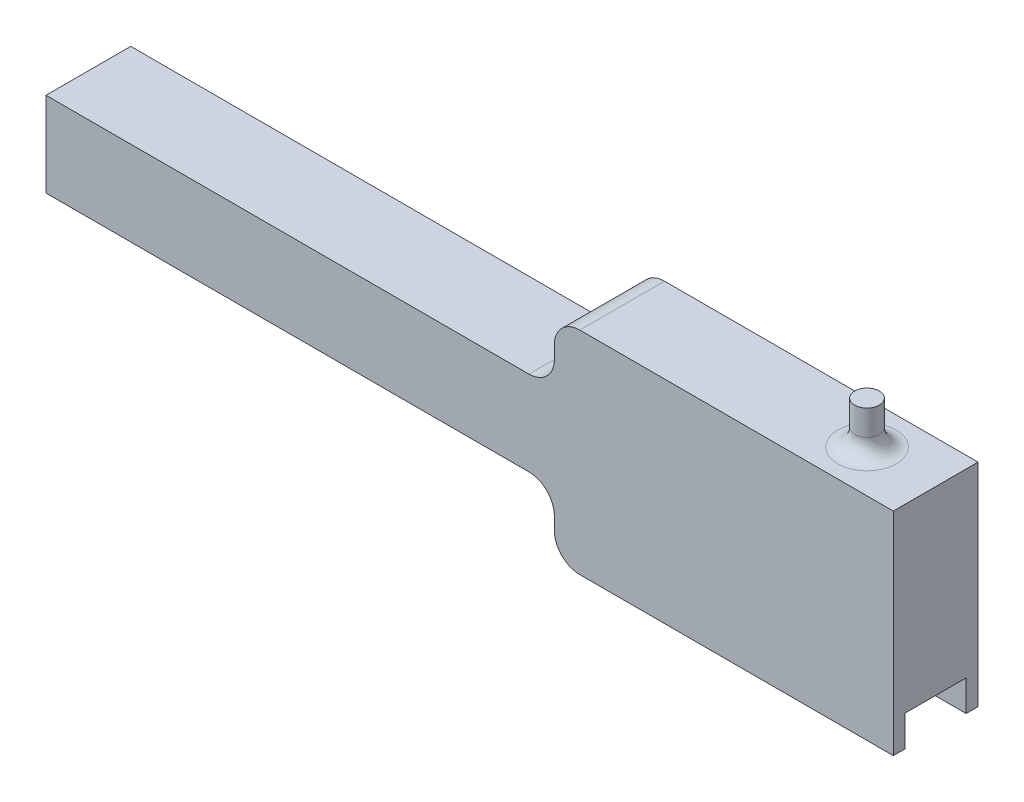
ISO-10303-21;
HEADER;
FILE_DESCRIPTION(('STEP AP214'),'2;1');
FILE_NAME('part.step','',(''),(''),'','','');
FILE_SCHEMA(('AUTOMOTIVE_DESIGN { 1 0 10303 214 1 1 1 1 }'));
ENDSEC;
DATA;
#1=APPLICATION_CONTEXT('core data for automotive mechanical design processes');
#2=APPLICATION_PROTOCOL_DEFINITION('international standard','automotive_design',2000,#1);
#3=PRODUCT_CONTEXT('',#1,'mechanical');
#4=PRODUCT('Part','Part','',(#3));
#5=PRODUCT_RELATED_PRODUCT_CATEGORY('part','',(#4));
#6=PRODUCT_DEFINITION_FORMATION('','',#4);
#7=PRODUCT_DEFINITION_CONTEXT('part definition',#1,'design');
#8=PRODUCT_DEFINITION('design','',#6,#7);
#9=PRODUCT_DEFINITION_SHAPE('','',#8);
#10=(LENGTH_UNIT() NAMED_UNIT(*) SI_UNIT(.MILLI.,.METRE.));
#11=(NAMED_UNIT(*) PLANE_ANGLE_UNIT() SI_UNIT($,.RADIAN.));
#12=(NAMED_UNIT(*) SI_UNIT($,.STERADIAN.) SOLID_ANGLE_UNIT());
#13=UNCERTAINTY_MEASURE_WITH_UNIT(LENGTH_MEASURE(1.E-05),#10,'distance_accuracy_value','');
#14=(GEOMETRIC_REPRESENTATION_CONTEXT(3) GLOBAL_UNCERTAINTY_ASSIGNED_CONTEXT((#13)) GLOBAL_UNIT_ASSIGNED_CONTEXT((#10,
#11,#12)) REPRESENTATION_CONTEXT('',''));
#15=CARTESIAN_POINT('',(0.,0.,0.));
#16=DIRECTION('',(0.,0.,1.));
#17=DIRECTION('',(1.,0.,0.));
#18=AXIS2_PLACEMENT_3D('',#15,#16,#17);
#19=CARTESIAN_POINT('',(50.,12.5,5.));
#20=DIRECTION('',(-1.,0.,0.));
#21=DIRECTION('',(0.,0.,1.));
#22=AXIS2_PLACEMENT_3D('',#19,#20,#21);
#23=PLANE('',#22);
#24=DIRECTION('',(0.,1.,0.));
#25=VECTOR('',#24,1.);
#26=CARTESIAN_POINT('',(50.,-23.3374351209131,-3.60000000000003));
#27=LINE('',#26,#25);
#28=CARTESIAN_POINT('',(50.,-12.5,-3.60000000000005));
#29=VERTEX_POINT('',#28);
#30=CARTESIAN_POINT('',(50.,-8.85000000000004,-3.60000000000005));
#31=VERTEX_POINT('',#30);
#32=EDGE_CURVE('E359',#29,#31,#27,.T.);
#33=ORIENTED_EDGE('',*,*,#32,.F.);
#34=DIRECTION('',(0.,0.,-1.));
#35=VECTOR('',#34,1.);
#36=CARTESIAN_POINT('',(50.,-12.5,5.));
#37=LINE('',#36,#35);
#38=CARTESIAN_POINT('',(50.,-12.5,-5.));
#39=VERTEX_POINT('',#38);
#40=EDGE_CURVE('E333',#29,#39,#37,.T.);
#41=ORIENTED_EDGE('',*,*,#40,.T.);
#42=DIRECTION('',(0.,-1.,0.));
#43=VECTOR('',#42,1.);
#44=CARTESIAN_POINT('',(50.,12.5,-5.));
#45=LINE('',#44,#43);
#46=CARTESIAN_POINT('',(50.,12.5,-5.));
#47=VERTEX_POINT('',#46);
#48=EDGE_CURVE('E205',#47,#39,#45,.T.);
#49=ORIENTED_EDGE('',*,*,#48,.F.);
#50=DIRECTION('',(0.,0.,-1.));
#51=VECTOR('',#50,1.);
#52=CARTESIAN_POINT('',(50.,12.5,5.));
#53=LINE('',#52,#51);
#54=CARTESIAN_POINT('',(50.,12.5,5.));
#55=VERTEX_POINT('',#54);
#56=EDGE_CURVE('E320',#55,#47,#53,.T.);
#57=ORIENTED_EDGE('',*,*,#56,.F.);
#58=DIRECTION('',(0.,-1.,0.));
#59=VECTOR('',#58,1.);
#60=CARTESIAN_POINT('',(50.,12.5,5.));
#61=LINE('',#60,#59);
#62=CARTESIAN_POINT('',(50.,-12.5,5.));
#63=VERTEX_POINT('',#62);
#64=EDGE_CURVE('E211',#55,#63,#61,.T.);
#65=ORIENTED_EDGE('',*,*,#64,.T.);
#66=CARTESIAN_POINT('',(50.,-12.5,3.60000000000005));
#67=VERTEX_POINT('',#66);
#68=EDGE_CURVE('E329',#63,#67,#37,.T.);
#69=ORIENTED_EDGE('',*,*,#68,.T.);
#70=DIRECTION('',(0.,1.,0.));
#71=VECTOR('',#70,1.);
#72=CARTESIAN_POINT('',(50.,-23.3374351209131,3.60000000000006));
#73=LINE('',#72,#71);
#74=CARTESIAN_POINT('',(50.,-8.85000000000003,3.60000000000004));
#75=VERTEX_POINT('',#74);
#76=EDGE_CURVE('E350',#67,#75,#73,.T.);
#77=ORIENTED_EDGE('',*,*,#76,.T.);
#78=DIRECTION('',(0.,0.,1.));
#79=VECTOR('',#78,1.);
#80=CARTESIAN_POINT('',(50.,-8.85000000000004,-3.60000000000005));
#81=LINE('',#80,#79);
#82=EDGE_CURVE('E361',#31,#75,#81,.T.);
#83=ORIENTED_EDGE('',*,*,#82,.F.);
#84=EDGE_LOOP('',(#33,#41,#49,#57,#65,#69,#77,#83));
#85=FACE_BOUND('',#84,.T.);
#86=ADVANCED_FACE('F33',(#85),#23,.F.);
#87=CARTESIAN_POINT('',(0.,-12.5,0.));
#88=DIRECTION('',(0.,-1.,0.));
#89=DIRECTION('',(0.,0.,-1.));
#90=AXIS2_PLACEMENT_3D('',#87,#88,#89);
#91=PLANE('',#90);
#92=DIRECTION('',(1.,0.,0.));
#93=VECTOR('',#92,1.);
#94=CARTESIAN_POINT('',(-50.,-12.5,5.));
#95=LINE('',#94,#93);
#96=CARTESIAN_POINT('',(13.,-12.5,5.));
#97=VERTEX_POINT('',#96);
#98=EDGE_CURVE('E325',#97,#63,#95,.T.);
#99=ORIENTED_EDGE('',*,*,#98,.F.);
#100=DIRECTION('',(0.,0.,1.));
#101=VECTOR('',#100,1.);
#102=CARTESIAN_POINT('',(13.,-12.5,-5.));
#103=LINE('',#102,#101);
#104=CARTESIAN_POINT('',(13.,-12.5,-5.));
#105=VERTEX_POINT('',#104);
#106=EDGE_CURVE('E48',#97,#105,#103,.F.);
#107=ORIENTED_EDGE('',*,*,#106,.T.);
#108=DIRECTION('',(-1.,0.,0.));
#109=VECTOR('',#108,1.);
#110=CARTESIAN_POINT('',(-50.,-12.5,-5.));
#111=LINE('',#110,#109);
#112=EDGE_CURVE('E332',#39,#105,#111,.T.);
#113=ORIENTED_EDGE('',*,*,#112,.F.);
#114=ORIENTED_EDGE('',*,*,#40,.F.);
#115=DIRECTION('',(1.,0.,0.));
#116=VECTOR('',#115,1.);
#117=CARTESIAN_POINT('',(41.9000000000001,-12.5,-3.6000000000001));
#118=LINE('',#117,#116);
#119=CARTESIAN_POINT('',(41.9000000000001,-12.5,-3.6000000000001));
#120=VERTEX_POINT('',#119);
#121=EDGE_CURVE('E345',#120,#29,#118,.T.);
#122=ORIENTED_EDGE('',*,*,#121,.F.);
#123=CARTESIAN_POINT('',(41.9000000000001,-12.5,0.));
#124=DIRECTION('',(0.,-1.,0.));
#125=DIRECTION('',(0.,0.,-1.));
#126=AXIS2_PLACEMENT_3D('',#123,#124,#125);
#127=CIRCLE('',#126,3.6);
#128=CARTESIAN_POINT('',(39.518823820042,-12.5,-2.7000000000001));
#129=VERTEX_POINT('',#128);
#130=EDGE_CURVE('E217',#120,#129,#127,.F.);
#131=ORIENTED_EDGE('',*,*,#130,.T.);
#132=CARTESIAN_POINT('',(41.9624379466995,-12.5,0.));
#133=DIRECTION('',(0.,-1.,0.));
#134=DIRECTION('',(0.,0.,-1.));
#135=AXIS2_PLACEMENT_3D('',#132,#133,#134);
#136=CIRCLE('',#135,3.64159992311072);
#137=CARTESIAN_POINT('',(39.518823820042,-12.5,2.6999999999999));
#138=VERTEX_POINT('',#137);
#139=EDGE_CURVE('E209',#129,#138,#136,.F.);
#140=ORIENTED_EDGE('',*,*,#139,.T.);
#141=CARTESIAN_POINT('',(41.9000000000001,-12.5,3.60000000000009));
#142=VERTEX_POINT('',#141);
#143=EDGE_CURVE('E218',#138,#142,#127,.F.);
#144=ORIENTED_EDGE('',*,*,#143,.T.);
#145=DIRECTION('',(-1.,0.,0.));
#146=VECTOR('',#145,1.);
#147=CARTESIAN_POINT('',(41.9000000000001,-12.5,3.60000000000009));
#148=LINE('',#147,#146);
#149=EDGE_CURVE('E340',#67,#142,#148,.T.);
#150=ORIENTED_EDGE('',*,*,#149,.F.);
#151=ORIENTED_EDGE('',*,*,#68,.F.);
#152=EDGE_LOOP('',(#99,#107,#113,#114,#122,#131,#140,#144,#150,#151));
#153=FACE_BOUND('',#152,.T.);
#154=ADVANCED_FACE('F283',(#153),#91,.T.);
#155=CARTESIAN_POINT('',(41.9000000000001,-10.85,0.));
#156=DIRECTION('',(0.,1.,0.));
#157=DIRECTION('',(0.,0.,1.));
#158=AXIS2_PLACEMENT_3D('',#155,#156,#157);
#159=CYLINDRICAL_SURFACE('',#158,3.6);
#160=ORIENTED_EDGE('',*,*,#130,.F.);
#161=DIRECTION('',(0.,1.,0.));
#162=VECTOR('',#161,1.);
#163=CARTESIAN_POINT('',(41.9000000000001,-23.3374351209131,-3.60000000000008));
#164=LINE('',#163,#162);
#165=CARTESIAN_POINT('',(41.9000000000001,-8.85000000000004,-3.6000000000001));
#166=VERTEX_POINT('',#165);
#167=EDGE_CURVE('E354',#120,#166,#164,.T.);
#168=ORIENTED_EDGE('',*,*,#167,.T.);
#169=CARTESIAN_POINT('',(41.9000000000001,-8.85000000000004,0.));
#170=DIRECTION('',(0.,-1.,0.));
#171=DIRECTION('',(0.,0.,-1.));
#172=AXIS2_PLACEMENT_3D('',#169,#170,#171);
#173=CIRCLE('',#172,3.6);
#174=CARTESIAN_POINT('',(39.518823820042,-8.85000000000004,-2.70000000000009));
#175=VERTEX_POINT('',#174);
#176=EDGE_CURVE('E384',#175,#166,#173,.T.);
#177=ORIENTED_EDGE('',*,*,#176,.F.);
#178=DIRECTION('',(0.,1.,0.));
#179=VECTOR('',#178,1.);
#180=CARTESIAN_POINT('',(39.518823820042,-10.85,-2.7000000000001));
#181=LINE('',#180,#179);
#182=CARTESIAN_POINT('',(39.518823820042,-10.85,-2.7000000000001));
#183=VERTEX_POINT('',#182);
#184=EDGE_CURVE('E397',#183,#175,#181,.T.);
#185=ORIENTED_EDGE('',*,*,#184,.F.);
#186=DIRECTION('',(0.,1.,0.));
#187=VECTOR('',#186,1.);
#188=CARTESIAN_POINT('',(39.518823820042,-12.85,-2.7000000000001));
#189=LINE('',#188,#187);
#190=EDGE_CURVE('E367',#129,#183,#189,.T.);
#191=ORIENTED_EDGE('',*,*,#190,.F.);
#192=EDGE_LOOP('',(#160,#168,#177,#185,#191));
#193=FACE_BOUND('',#192,.T.);
#194=ADVANCED_FACE('F291',(#193),#159,.F.);
#195=CARTESIAN_POINT('',(-50.,12.5,-5.));
#196=DIRECTION('',(0.,0.,1.));
#197=DIRECTION('',(1.,0.,0.));
#198=AXIS2_PLACEMENT_3D('',#195,#196,#197);
#199=PLANE('',#198);
#200=DIRECTION('',(0.,1.,0.));
#201=VECTOR('',#200,1.);
#202=CARTESIAN_POINT('',(9.99999999999999,12.5,-5.));
#203=LINE('',#202,#201);
#204=CARTESIAN_POINT('',(9.99999999999999,8.,-5.));
#205=VERTEX_POINT('',#204);
#206=CARTESIAN_POINT('',(9.99999999999999,9.5,-5.));
#207=VERTEX_POINT('',#206);
#208=EDGE_CURVE('E316',#205,#207,#203,.T.);
#209=ORIENTED_EDGE('',*,*,#208,.T.);
#210=CARTESIAN_POINT('',(13.,9.5,-5.));
#211=DIRECTION('',(0.,0.,1.));
#212=DIRECTION('',(1.,0.,0.));
#213=AXIS2_PLACEMENT_3D('',#210,#211,#212);
#214=CIRCLE('',#213,3.);
#215=CARTESIAN_POINT('',(13.,12.5,-5.));
#216=VERTEX_POINT('',#215);
#217=EDGE_CURVE('E247',#207,#216,#214,.F.);
#218=ORIENTED_EDGE('',*,*,#217,.T.);
#219=DIRECTION('',(-1.,0.,0.));
#220=VECTOR('',#219,1.);
#221=CARTESIAN_POINT('',(-50.,12.5,-5.));
#222=LINE('',#221,#220);
#223=EDGE_CURVE('E313',#47,#216,#222,.T.);
#224=ORIENTED_EDGE('',*,*,#223,.F.);
#225=ORIENTED_EDGE('',*,*,#48,.T.);
#226=ORIENTED_EDGE('',*,*,#112,.T.);
#227=CARTESIAN_POINT('',(13.,-9.5,-5.));
#228=DIRECTION('',(0.,0.,1.));
#229=DIRECTION('',(1.,0.,0.));
#230=AXIS2_PLACEMENT_3D('',#227,#228,#229);
#231=CIRCLE('',#230,3.);
#232=CARTESIAN_POINT('',(9.99999999999999,-9.5,-5.));
#233=VERTEX_POINT('',#232);
#234=EDGE_CURVE('E245',#105,#233,#231,.F.);
#235=ORIENTED_EDGE('',*,*,#234,.T.);
#236=DIRECTION('',(0.,1.,0.));
#237=VECTOR('',#236,1.);
#238=CARTESIAN_POINT('',(9.99999999999999,-12.5,-5.));
#239=LINE('',#238,#237);
#240=CARTESIAN_POINT('',(9.99999999999999,-8.,-5.));
#241=VERTEX_POINT('',#240);
#242=EDGE_CURVE('E190',#233,#241,#239,.T.);
#243=ORIENTED_EDGE('',*,*,#242,.T.);
#244=CARTESIAN_POINT('',(6.99999999999999,-8.,-5.));
#245=DIRECTION('',(0.,0.,1.));
#246=DIRECTION('',(1.,0.,0.));
#247=AXIS2_PLACEMENT_3D('',#244,#245,#246);
#248=CIRCLE('',#247,3.);
#249=CARTESIAN_POINT('',(6.99999999999999,-5.,-5.));
#250=VERTEX_POINT('',#249);
#251=EDGE_CURVE('E11',#241,#250,#248,.T.);
#252=ORIENTED_EDGE('',*,*,#251,.T.);
#253=DIRECTION('',(-1.,0.,0.));
#254=VECTOR('',#253,1.);
#255=CARTESIAN_POINT('',(-50.,-5.,-5.));
#256=LINE('',#255,#254);
#257=CARTESIAN_POINT('',(-50.,-5.,-5.));
#258=VERTEX_POINT('',#257);
#259=EDGE_CURVE('E178',#250,#258,#256,.T.);
#260=ORIENTED_EDGE('',*,*,#259,.T.);
#261=DIRECTION('',(0.,-1.,0.));
#262=VECTOR('',#261,1.);
#263=CARTESIAN_POINT('',(-50.,12.5,-5.));
#264=LINE('',#263,#262);
#265=CARTESIAN_POINT('',(-50.,5.,-5.));
#266=VERTEX_POINT('',#265);
#267=EDGE_CURVE('E183',#266,#258,#264,.T.);
#268=ORIENTED_EDGE('',*,*,#267,.F.);
#269=DIRECTION('',(1.,0.,0.));
#270=VECTOR('',#269,1.);
#271=CARTESIAN_POINT('',(-50.,5.,-5.));
#272=LINE('',#271,#270);
#273=CARTESIAN_POINT('',(6.99999999999999,5.,-5.));
#274=VERTEX_POINT('',#273);
#275=EDGE_CURVE('E199',#266,#274,#272,.T.);
#276=ORIENTED_EDGE('',*,*,#275,.T.);
#277=CARTESIAN_POINT('',(6.99999999999999,8.,-5.));
#278=DIRECTION('',(0.,0.,1.));
#279=DIRECTION('',(1.,0.,0.));
#280=AXIS2_PLACEMENT_3D('',#277,#278,#279);
#281=CIRCLE('',#280,3.);
#282=EDGE_CURVE('E260',#274,#205,#281,.T.);
#283=ORIENTED_EDGE('',*,*,#282,.T.);
#284=EDGE_LOOP('',(#209,#218,#224,#225,#226,#235,#243,#252,#260,#268,#276,#283));
#285=FACE_BOUND('',#284,.T.);
#286=ADVANCED_FACE('F181',(#285),#199,.F.);
#287=CARTESIAN_POINT('',(-50.,12.5,5.));
#288=DIRECTION('',(1.,0.,0.));
#289=DIRECTION('',(0.,0.,-1.));
#290=AXIS2_PLACEMENT_3D('',#287,#288,#289);
#291=PLANE('',#290);
#292=ORIENTED_EDGE('',*,*,#267,.T.);
#293=DIRECTION('',(0.,0.,1.));
#294=VECTOR('',#293,1.);
#295=CARTESIAN_POINT('',(-50.,-5.,-5.));
#296=LINE('',#295,#294);
#297=CARTESIAN_POINT('',(-50.,-5.,5.));
#298=VERTEX_POINT('',#297);
#299=EDGE_CURVE('E189',#258,#298,#296,.T.);
#300=ORIENTED_EDGE('',*,*,#299,.T.);
#301=DIRECTION('',(0.,-1.,0.));
#302=VECTOR('',#301,1.);
#303=CARTESIAN_POINT('',(-50.,12.5,5.));
#304=LINE('',#303,#302);
#305=CARTESIAN_POINT('',(-50.,5.,5.));
#306=VERTEX_POINT('',#305);
#307=EDGE_CURVE('E206',#306,#298,#304,.T.);
#308=ORIENTED_EDGE('',*,*,#307,.F.);
#309=DIRECTION('',(0.,0.,1.));
#310=VECTOR('',#309,1.);
#311=CARTESIAN_POINT('',(-50.,5.,-5.));
#312=LINE('',#311,#310);
#313=EDGE_CURVE('E204',#266,#306,#312,.T.);
#314=ORIENTED_EDGE('',*,*,#313,.F.);
#315=EDGE_LOOP('',(#292,#300,#308,#314));
#316=FACE_BOUND('',#315,.T.);
#317=ADVANCED_FACE('F202',(#316),#291,.F.);
#318=CARTESIAN_POINT('',(-50.,12.5,5.));
#319=DIRECTION('',(0.,0.,-1.));
#320=DIRECTION('',(-1.,0.,0.));
#321=AXIS2_PLACEMENT_3D('',#318,#319,#320);
#322=PLANE('',#321);
#323=DIRECTION('',(1.,0.,0.));
#324=VECTOR('',#323,1.);
#325=CARTESIAN_POINT('',(-50.,12.5,5.));
#326=LINE('',#325,#324);
#327=CARTESIAN_POINT('',(13.,12.5,5.));
#328=VERTEX_POINT('',#327);
#329=EDGE_CURVE('E322',#328,#55,#326,.T.);
#330=ORIENTED_EDGE('',*,*,#329,.F.);
#331=CARTESIAN_POINT('',(13.,9.5,5.));
#332=DIRECTION('',(0.,0.,-1.));
#333=DIRECTION('',(-1.,0.,0.));
#334=AXIS2_PLACEMENT_3D('',#331,#332,#333);
#335=CIRCLE('',#334,3.);
#336=CARTESIAN_POINT('',(9.99999999999999,9.5,5.));
#337=VERTEX_POINT('',#336);
#338=EDGE_CURVE('E238',#328,#337,#335,.F.);
#339=ORIENTED_EDGE('',*,*,#338,.T.);
#340=DIRECTION('',(0.,-1.,0.));
#341=VECTOR('',#340,1.);
#342=CARTESIAN_POINT('',(9.99999999999999,12.5,5.));
#343=LINE('',#342,#341);
#344=CARTESIAN_POINT('',(9.99999999999999,8.,5.));
#345=VERTEX_POINT('',#344);
#346=EDGE_CURVE('E411',#337,#345,#343,.T.);
#347=ORIENTED_EDGE('',*,*,#346,.T.);
#348=CARTESIAN_POINT('',(6.99999999999999,8.,5.));
#349=DIRECTION('',(0.,0.,-1.));
#350=DIRECTION('',(-1.,0.,0.));
#351=AXIS2_PLACEMENT_3D('',#348,#349,#350);
#352=CIRCLE('',#351,3.);
#353=CARTESIAN_POINT('',(6.99999999999999,5.,5.));
#354=VERTEX_POINT('',#353);
#355=EDGE_CURVE('E258',#345,#354,#352,.T.);
#356=ORIENTED_EDGE('',*,*,#355,.T.);
#357=DIRECTION('',(-1.,0.,0.));
#358=VECTOR('',#357,1.);
#359=CARTESIAN_POINT('',(-50.,5.,5.));
#360=LINE('',#359,#358);
#361=EDGE_CURVE('E227',#354,#306,#360,.T.);
#362=ORIENTED_EDGE('',*,*,#361,.T.);
#363=ORIENTED_EDGE('',*,*,#307,.T.);
#364=DIRECTION('',(1.,0.,0.));
#365=VECTOR('',#364,1.);
#366=CARTESIAN_POINT('',(-50.,-5.,5.));
#367=LINE('',#366,#365);
#368=CARTESIAN_POINT('',(6.99999999999999,-5.,5.));
#369=VERTEX_POINT('',#368);
#370=EDGE_CURVE('E195',#298,#369,#367,.T.);
#371=ORIENTED_EDGE('',*,*,#370,.T.);
#372=CARTESIAN_POINT('',(6.99999999999999,-8.,5.));
#373=DIRECTION('',(0.,0.,-1.));
#374=DIRECTION('',(-1.,0.,0.));
#375=AXIS2_PLACEMENT_3D('',#372,#373,#374);
#376=CIRCLE('',#375,3.);
#377=CARTESIAN_POINT('',(9.99999999999999,-8.,5.));
#378=VERTEX_POINT('',#377);
#379=EDGE_CURVE('E41',#369,#378,#376,.T.);
#380=ORIENTED_EDGE('',*,*,#379,.T.);
#381=DIRECTION('',(0.,-1.,0.));
#382=VECTOR('',#381,1.);
#383=CARTESIAN_POINT('',(9.99999999999999,12.5,5.));
#384=LINE('',#383,#382);
#385=CARTESIAN_POINT('',(9.99999999999999,-9.5,5.));
#386=VERTEX_POINT('',#385);
#387=EDGE_CURVE('E229',#378,#386,#384,.T.);
#388=ORIENTED_EDGE('',*,*,#387,.T.);
#389=CARTESIAN_POINT('',(13.,-9.5,5.));
#390=DIRECTION('',(0.,0.,-1.));
#391=DIRECTION('',(-1.,0.,0.));
#392=AXIS2_PLACEMENT_3D('',#389,#390,#391);
#393=CIRCLE('',#392,3.);
#394=EDGE_CURVE('E236',#386,#97,#393,.F.);
#395=ORIENTED_EDGE('',*,*,#394,.T.);
#396=ORIENTED_EDGE('',*,*,#98,.T.);
#397=ORIENTED_EDGE('',*,*,#64,.F.);
#398=EDGE_LOOP('',(#330,#339,#347,#356,#362,#363,#371,#380,#388,#395,#396,#397));
#399=FACE_BOUND('',#398,.T.);
#400=ADVANCED_FACE('F264',(#399),#322,.F.);
#401=CARTESIAN_POINT('',(0.,12.5,0.));
#402=DIRECTION('',(0.,-1.,0.));
#403=DIRECTION('',(0.,0.,-1.));
#404=AXIS2_PLACEMENT_3D('',#401,#402,#403);
#405=PLANE('',#404);
#406=CARTESIAN_POINT('',(41.9000000000001,12.5,0.));
#407=DIRECTION('',(0.,-1.,0.));
#408=DIRECTION('',(0.,0.,-1.));
#409=AXIS2_PLACEMENT_3D('',#406,#407,#408);
#410=CIRCLE('',#409,3.45);
#411=CARTESIAN_POINT('',(41.9000000000001,12.5,-3.4500000000001));
#412=VERTEX_POINT('',#411);
#413=EDGE_CURVE('E224',#412,#412,#410,.T.);
#414=ORIENTED_EDGE('',*,*,#413,.T.);
#415=EDGE_LOOP('',(#414));
#416=FACE_BOUND('',#415,.T.);
#417=ORIENTED_EDGE('',*,*,#223,.T.);
#418=DIRECTION('',(0.,0.,1.));
#419=VECTOR('',#418,1.);
#420=CARTESIAN_POINT('',(13.,12.5,0.));
#421=LINE('',#420,#419);
#422=EDGE_CURVE('E233',#216,#328,#421,.T.);
#423=ORIENTED_EDGE('',*,*,#422,.T.);
#424=ORIENTED_EDGE('',*,*,#329,.T.);
#425=ORIENTED_EDGE('',*,*,#56,.T.);
#426=EDGE_LOOP('',(#417,#423,#424,#425));
#427=FACE_BOUND('',#426,.T.);
#428=ADVANCED_FACE('F318',(#416,#427),#405,.F.);
#429=CARTESIAN_POINT('',(41.7705879580493,-10.85,-2.80392757560044));
#430=DIRECTION('',(-0.0461047666084017,0.,-0.998936609848685));
#431=DIRECTION('',(0.998936609848686,0.,-0.0461047666084017));
#432=AXIS2_PLACEMENT_3D('',#429,#430,#431);
#433=PLANE('',#432);
#434=DIRECTION('',(-0.998936609848686,0.,0.0461047666084017));
#435=VECTOR('',#434,1.);
#436=CARTESIAN_POINT('',(41.7705879580493,-8.85000000000004,-2.80392757560044));
#437=LINE('',#436,#435);
#438=CARTESIAN_POINT('',(26.518823820042,-8.85000000000004,-2.10000000000008));
#439=VERTEX_POINT('',#438);
#440=EDGE_CURVE('E371',#175,#439,#437,.T.);
#441=ORIENTED_EDGE('',*,*,#440,.T.);
#442=DIRECTION('',(0.,1.,0.));
#443=VECTOR('',#442,1.);
#444=CARTESIAN_POINT('',(26.518823820042,-10.85,-2.10000000000008));
#445=LINE('',#444,#443);
#446=CARTESIAN_POINT('',(26.518823820042,-10.85,-2.10000000000008));
#447=VERTEX_POINT('',#446);
#448=EDGE_CURVE('E380',#447,#439,#445,.T.);
#449=ORIENTED_EDGE('',*,*,#448,.F.);
#450=DIRECTION('',(-0.998936609848686,0.,0.0461047666084017));
#451=VECTOR('',#450,1.);
#452=CARTESIAN_POINT('',(41.7705879580493,-10.85,-2.80392757560044));
#453=LINE('',#452,#451);
#454=EDGE_CURVE('E372',#183,#447,#453,.T.);
#455=ORIENTED_EDGE('',*,*,#454,.F.);
#456=ORIENTED_EDGE('',*,*,#184,.T.);
#457=EDGE_LOOP('',(#441,#449,#455,#456));
#458=FACE_BOUND('',#457,.T.);
#459=ADVANCED_FACE('F438',(#458),#433,.F.);
#460=DIRECTION('',(0.,1.,0.));
#461=VECTOR('',#460,1.);
#462=CARTESIAN_POINT('',(41.9000000000001,-23.3374351209131,3.60000000000011));
#463=LINE('',#462,#461);
#464=CARTESIAN_POINT('',(41.9000000000001,-8.85000000000005,3.60000000000009));
#465=VERTEX_POINT('',#464);
#466=EDGE_CURVE('E358',#142,#465,#463,.T.);
#467=ORIENTED_EDGE('',*,*,#466,.F.);
#468=ORIENTED_EDGE('',*,*,#143,.F.);
#469=DIRECTION('',(0.,1.,0.));
#470=VECTOR('',#469,1.);
#471=CARTESIAN_POINT('',(39.518823820042,-12.85,2.6999999999999));
#472=LINE('',#471,#470);
#473=CARTESIAN_POINT('',(39.518823820042,-10.85,2.6999999999999));
#474=VERTEX_POINT('',#473);
#475=EDGE_CURVE('E369',#138,#474,#472,.T.);
#476=ORIENTED_EDGE('',*,*,#475,.T.);
#477=DIRECTION('',(0.,1.,0.));
#478=VECTOR('',#477,1.);
#479=CARTESIAN_POINT('',(39.518823820042,-10.85,2.6999999999999));
#480=LINE('',#479,#478);
#481=CARTESIAN_POINT('',(39.518823820042,-8.85000000000005,2.69999999999991));
#482=VERTEX_POINT('',#481);
#483=EDGE_CURVE('E395',#474,#482,#480,.T.);
#484=ORIENTED_EDGE('',*,*,#483,.T.);
#485=EDGE_CURVE('E383',#465,#482,#173,.T.);
#486=ORIENTED_EDGE('',*,*,#485,.F.);
#487=EDGE_LOOP('',(#467,#468,#476,#484,#486));
#488=FACE_BOUND('',#487,.T.);
#489=ADVANCED_FACE('F427',(#488),#159,.F.);
#490=CARTESIAN_POINT('',(41.7705879580493,-10.85,2.80392757560024));
#491=DIRECTION('',(0.0461047666084,0.,-0.998936609848685));
#492=DIRECTION('',(0.998936609848686,0.,0.0461047666084));
#493=AXIS2_PLACEMENT_3D('',#490,#491,#492);
#494=PLANE('',#493);
#495=DIRECTION('',(-0.998936609848686,0.,-0.0461047666084));
#496=VECTOR('',#495,1.);
#497=CARTESIAN_POINT('',(41.7705879580493,-8.85000000000005,2.80392757560024));
#498=LINE('',#497,#496);
#499=CARTESIAN_POINT('',(26.518823820042,-8.85000000000005,2.09999999999992));
#500=VERTEX_POINT('',#499);
#501=EDGE_CURVE('E387',#482,#500,#498,.T.);
#502=ORIENTED_EDGE('',*,*,#501,.F.);
#503=ORIENTED_EDGE('',*,*,#483,.F.);
#504=DIRECTION('',(-0.998936609848686,0.,-0.0461047666084));
#505=VECTOR('',#504,1.);
#506=CARTESIAN_POINT('',(41.7705879580493,-10.85,2.80392757560024));
#507=LINE('',#506,#505);
#508=CARTESIAN_POINT('',(26.518823820042,-10.85,2.09999999999991));
#509=VERTEX_POINT('',#508);
#510=EDGE_CURVE('E375',#474,#509,#507,.T.);
#511=ORIENTED_EDGE('',*,*,#510,.T.);
#512=DIRECTION('',(0.,1.,0.));
#513=VECTOR('',#512,1.);
#514=CARTESIAN_POINT('',(26.518823820042,-10.85,2.09999999999991));
#515=LINE('',#514,#513);
#516=EDGE_CURVE('E392',#509,#500,#515,.T.);
#517=ORIENTED_EDGE('',*,*,#516,.T.);
#518=EDGE_LOOP('',(#502,#503,#511,#517));
#519=FACE_BOUND('',#518,.T.);
#520=ADVANCED_FACE('F431',(#519),#494,.T.);
#521=CARTESIAN_POINT('',(26.518823820042,-10.85,0.));
#522=DIRECTION('',(0.,1.,0.));
#523=DIRECTION('',(0.,0.,1.));
#524=AXIS2_PLACEMENT_3D('',#521,#522,#523);
#525=CYLINDRICAL_SURFACE('',#524,2.1);
#526=CARTESIAN_POINT('',(26.518823820042,-8.85000000000005,0.));
#527=DIRECTION('',(0.,-1.,0.));
#528=DIRECTION('',(0.,0.,-1.));
#529=AXIS2_PLACEMENT_3D('',#526,#527,#528);
#530=CIRCLE('',#529,2.1);
#531=EDGE_CURVE('E376',#500,#439,#530,.T.);
#532=ORIENTED_EDGE('',*,*,#531,.F.);
#533=ORIENTED_EDGE('',*,*,#516,.F.);
#534=CARTESIAN_POINT('',(26.518823820042,-10.85,0.));
#535=DIRECTION('',(0.,-1.,0.));
#536=DIRECTION('',(0.,0.,-1.));
#537=AXIS2_PLACEMENT_3D('',#534,#535,#536);
#538=CIRCLE('',#537,2.1);
#539=EDGE_CURVE('E378',#509,#447,#538,.T.);
#540=ORIENTED_EDGE('',*,*,#539,.T.);
#541=ORIENTED_EDGE('',*,*,#448,.T.);
#542=EDGE_LOOP('',(#532,#533,#540,#541));
#543=FACE_BOUND('',#542,.T.);
#544=ADVANCED_FACE('F436',(#543),#525,.F.);
#545=CARTESIAN_POINT('',(41.9000000000001,-10.85,0.));
#546=DIRECTION('',(0.,-1.,0.));
#547=DIRECTION('',(0.,0.,-1.));
#548=AXIS2_PLACEMENT_3D('',#545,#546,#547);
#549=PLANE('',#548);
#550=CARTESIAN_POINT('',(41.9624379466995,-10.85,0.));
#551=DIRECTION('',(0.,-1.,0.));
#552=DIRECTION('',(0.,0.,-1.));
#553=AXIS2_PLACEMENT_3D('',#550,#551,#552);
#554=CIRCLE('',#553,3.64159992311072);
#555=EDGE_CURVE('E348',#474,#183,#554,.T.);
#556=ORIENTED_EDGE('',*,*,#555,.T.);
#557=ORIENTED_EDGE('',*,*,#454,.T.);
#558=ORIENTED_EDGE('',*,*,#539,.F.);
#559=ORIENTED_EDGE('',*,*,#510,.F.);
#560=EDGE_LOOP('',(#556,#557,#558,#559));
#561=FACE_BOUND('',#560,.T.);
#562=ADVANCED_FACE('F440',(#561),#549,.F.);
#563=CARTESIAN_POINT('',(41.9000000000001,-8.85000000000004,0.));
#564=DIRECTION('',(0.,-1.,0.));
#565=DIRECTION('',(0.,0.,-1.));
#566=AXIS2_PLACEMENT_3D('',#563,#564,#565);
#567=PLANE('',#566);
#568=ORIENTED_EDGE('',*,*,#176,.T.);
#569=DIRECTION('',(1.,0.,0.));
#570=VECTOR('',#569,1.);
#571=CARTESIAN_POINT('',(41.9000000000001,-8.85000000000004,-3.6000000000001));
#572=LINE('',#571,#570);
#573=EDGE_CURVE('E357',#166,#31,#572,.T.);
#574=ORIENTED_EDGE('',*,*,#573,.T.);
#575=ORIENTED_EDGE('',*,*,#82,.T.);
#576=DIRECTION('',(-1.,0.,0.));
#577=VECTOR('',#576,1.);
#578=CARTESIAN_POINT('',(41.9000000000001,-8.85000000000003,3.60000000000009));
#579=LINE('',#578,#577);
#580=EDGE_CURVE('E346',#75,#465,#579,.T.);
#581=ORIENTED_EDGE('',*,*,#580,.T.);
#582=ORIENTED_EDGE('',*,*,#485,.T.);
#583=ORIENTED_EDGE('',*,*,#501,.T.);
#584=ORIENTED_EDGE('',*,*,#531,.T.);
#585=ORIENTED_EDGE('',*,*,#440,.F.);
#586=EDGE_LOOP('',(#568,#574,#575,#581,#582,#583,#584,#585));
#587=FACE_BOUND('',#586,.T.);
#588=ADVANCED_FACE('F418',(#587),#567,.T.);
#589=CARTESIAN_POINT('',(41.9624379466995,-12.85,0.));
#590=DIRECTION('',(0.,1.,0.));
#591=DIRECTION('',(0.,0.,1.));
#592=AXIS2_PLACEMENT_3D('',#589,#590,#591);
#593=CYLINDRICAL_SURFACE('',#592,3.64159992311072);
#594=ORIENTED_EDGE('',*,*,#190,.T.);
#595=ORIENTED_EDGE('',*,*,#555,.F.);
#596=ORIENTED_EDGE('',*,*,#475,.F.);
#597=ORIENTED_EDGE('',*,*,#139,.F.);
#598=EDGE_LOOP('',(#594,#595,#596,#597));
#599=FACE_BOUND('',#598,.T.);
#600=ADVANCED_FACE('F442',(#599),#593,.F.);
#601=CARTESIAN_POINT('',(41.9000000000001,-23.3374351209131,-3.60000000000008));
#602=DIRECTION('',(0.,0.,1.));
#603=DIRECTION('',(1.,0.,0.));
#604=AXIS2_PLACEMENT_3D('',#601,#602,#603);
#605=PLANE('',#604);
#606=ORIENTED_EDGE('',*,*,#121,.T.);
#607=ORIENTED_EDGE('',*,*,#32,.T.);
#608=ORIENTED_EDGE('',*,*,#573,.F.);
#609=ORIENTED_EDGE('',*,*,#167,.F.);
#610=EDGE_LOOP('',(#606,#607,#608,#609));
#611=FACE_BOUND('',#610,.T.);
#612=ADVANCED_FACE('F447',(#611),#605,.T.);
#613=CARTESIAN_POINT('',(41.9000000000001,-23.3374351209131,3.60000000000011));
#614=DIRECTION('',(0.,0.,-1.));
#615=DIRECTION('',(-1.,0.,0.));
#616=AXIS2_PLACEMENT_3D('',#613,#614,#615);
#617=PLANE('',#616);
#618=ORIENTED_EDGE('',*,*,#149,.T.);
#619=ORIENTED_EDGE('',*,*,#466,.T.);
#620=ORIENTED_EDGE('',*,*,#580,.F.);
#621=ORIENTED_EDGE('',*,*,#76,.F.);
#622=EDGE_LOOP('',(#618,#619,#620,#621));
#623=FACE_BOUND('',#622,.T.);
#624=ADVANCED_FACE('F422',(#623),#617,.T.);
#625=CARTESIAN_POINT('',(41.9000000000001,17.5,0.));
#626=DIRECTION('',(0.,-1.,0.));
#627=DIRECTION('',(0.,0.,-1.));
#628=AXIS2_PLACEMENT_3D('',#625,#626,#627);
#629=CYLINDRICAL_SURFACE('',#628,1.45);
#630=CARTESIAN_POINT('',(41.9000000000001,14.5,0.));
#631=DIRECTION('',(0.,-1.,0.));
#632=DIRECTION('',(0.,0.,-1.));
#633=AXIS2_PLACEMENT_3D('',#630,#631,#632);
#634=CIRCLE('',#633,1.45);
#635=CARTESIAN_POINT('',(41.9000000000001,14.5,-1.4500000000001));
#636=VERTEX_POINT('',#635);
#637=EDGE_CURVE('E221',#636,#636,#634,.F.);
#638=ORIENTED_EDGE('',*,*,#637,.T.);
#639=EDGE_LOOP('',(#638));
#640=FACE_BOUND('',#639,.T.);
#641=CARTESIAN_POINT('',(41.9000000000001,17.5,0.));
#642=DIRECTION('',(0.,1.,0.));
#643=DIRECTION('',(0.,0.,1.));
#644=AXIS2_PLACEMENT_3D('',#641,#642,#643);
#645=CIRCLE('',#644,1.45);
#646=CARTESIAN_POINT('',(41.9000000000001,17.5,1.4499999999999));
#647=VERTEX_POINT('',#646);
#648=EDGE_CURVE('E364',#647,#647,#645,.T.);
#649=ORIENTED_EDGE('',*,*,#648,.F.);
#650=EDGE_LOOP('',(#649));
#651=FACE_BOUND('',#650,.T.);
#652=ADVANCED_FACE('F454',(#640,#651),#629,.T.);
#653=CARTESIAN_POINT('',(41.9000000000001,17.5,0.));
#654=DIRECTION('',(0.,1.,0.));
#655=DIRECTION('',(0.,0.,1.));
#656=AXIS2_PLACEMENT_3D('',#653,#654,#655);
#657=PLANE('',#656);
#658=ORIENTED_EDGE('',*,*,#648,.T.);
#659=EDGE_LOOP('',(#658));
#660=FACE_BOUND('',#659,.T.);
#661=ADVANCED_FACE('F301',(#660),#657,.T.);
#662=CARTESIAN_POINT('',(41.9000000000001,14.5,0.));
#663=DIRECTION('',(0.,-1.,0.));
#664=DIRECTION('',(0.,0.,-1.));
#665=AXIS2_PLACEMENT_3D('',#662,#663,#664);
#666=TOROIDAL_SURFACE('',#665,3.45,2.);
#667=ORIENTED_EDGE('',*,*,#413,.F.);
#668=EDGE_LOOP('',(#667));
#669=FACE_BOUND('',#668,.T.);
#670=ORIENTED_EDGE('',*,*,#637,.F.);
#671=EDGE_LOOP('',(#670));
#672=FACE_BOUND('',#671,.T.);
#673=ADVANCED_FACE('F297',(#669,#672),#666,.F.);
#674=CARTESIAN_POINT('',(-50.,5.,-5.));
#675=DIRECTION('',(0.,-1.,0.));
#676=DIRECTION('',(0.,0.,-1.));
#677=AXIS2_PLACEMENT_3D('',#674,#675,#676);
#678=PLANE('',#677);
#679=ORIENTED_EDGE('',*,*,#361,.F.);
#680=DIRECTION('',(0.,0.,1.));
#681=VECTOR('',#680,1.);
#682=CARTESIAN_POINT('',(6.99999999999999,5.,-5.));
#683=LINE('',#682,#681);
#684=EDGE_CURVE('E56',#354,#274,#683,.F.);
#685=ORIENTED_EDGE('',*,*,#684,.T.);
#686=ORIENTED_EDGE('',*,*,#275,.F.);
#687=ORIENTED_EDGE('',*,*,#313,.T.);
#688=EDGE_LOOP('',(#679,#685,#686,#687));
#689=FACE_BOUND('',#688,.T.);
#690=ADVANCED_FACE('F300',(#689),#678,.F.);
#691=CARTESIAN_POINT('',(9.99999999999999,12.5,-5.));
#692=DIRECTION('',(1.,0.,0.));
#693=DIRECTION('',(0.,1.,0.));
#694=AXIS2_PLACEMENT_3D('',#691,#692,#693);
#695=PLANE('',#694);
#696=ORIENTED_EDGE('',*,*,#346,.F.);
#697=DIRECTION('',(0.,0.,1.));
#698=VECTOR('',#697,1.);
#699=CARTESIAN_POINT('',(9.99999999999999,9.5,-5.));
#700=LINE('',#699,#698);
#701=EDGE_CURVE('E243',#337,#207,#700,.F.);
#702=ORIENTED_EDGE('',*,*,#701,.T.);
#703=ORIENTED_EDGE('',*,*,#208,.F.);
#704=DIRECTION('',(0.,0.,1.));
#705=VECTOR('',#704,1.);
#706=CARTESIAN_POINT('',(9.99999999999999,8.,5.));
#707=LINE('',#706,#705);
#708=EDGE_CURVE('E240',#205,#345,#707,.T.);
#709=ORIENTED_EDGE('',*,*,#708,.T.);
#710=EDGE_LOOP('',(#696,#702,#703,#709));
#711=FACE_BOUND('',#710,.T.);
#712=ADVANCED_FACE('F565',(#711),#695,.F.);
#713=CARTESIAN_POINT('',(-50.,-5.,-5.));
#714=DIRECTION('',(0.,1.,0.));
#715=DIRECTION('',(0.,0.,1.));
#716=AXIS2_PLACEMENT_3D('',#713,#714,#715);
#717=PLANE('',#716);
#718=ORIENTED_EDGE('',*,*,#259,.F.);
#719=DIRECTION('',(0.,0.,1.));
#720=VECTOR('',#719,1.);
#721=CARTESIAN_POINT('',(6.99999999999999,-5.,5.));
#722=LINE('',#721,#720);
#723=EDGE_CURVE('E250',#250,#369,#722,.T.);
#724=ORIENTED_EDGE('',*,*,#723,.T.);
#725=ORIENTED_EDGE('',*,*,#370,.F.);
#726=ORIENTED_EDGE('',*,*,#299,.F.);
#727=EDGE_LOOP('',(#718,#724,#725,#726));
#728=FACE_BOUND('',#727,.T.);
#729=ADVANCED_FACE('F193',(#728),#717,.F.);
#730=CARTESIAN_POINT('',(9.99999999999999,-12.5,-5.));
#731=DIRECTION('',(1.,0.,0.));
#732=DIRECTION('',(0.,1.,0.));
#733=AXIS2_PLACEMENT_3D('',#730,#731,#732);
#734=PLANE('',#733);
#735=ORIENTED_EDGE('',*,*,#387,.F.);
#736=DIRECTION('',(0.,0.,1.));
#737=VECTOR('',#736,1.);
#738=CARTESIAN_POINT('',(9.99999999999999,-8.,-5.));
#739=LINE('',#738,#737);
#740=EDGE_CURVE('E255',#378,#241,#739,.F.);
#741=ORIENTED_EDGE('',*,*,#740,.T.);
#742=ORIENTED_EDGE('',*,*,#242,.F.);
#743=DIRECTION('',(0.,0.,1.));
#744=VECTOR('',#743,1.);
#745=CARTESIAN_POINT('',(9.99999999999999,-9.5,5.));
#746=LINE('',#745,#744);
#747=EDGE_CURVE('E252',#233,#386,#746,.T.);
#748=ORIENTED_EDGE('',*,*,#747,.T.);
#749=EDGE_LOOP('',(#735,#741,#742,#748));
#750=FACE_BOUND('',#749,.T.);
#751=ADVANCED_FACE('F268',(#750),#734,.F.);
#752=CARTESIAN_POINT('',(13.,9.5,0.));
#753=DIRECTION('',(0.,0.,1.));
#754=DIRECTION('',(1.,0.,0.));
#755=AXIS2_PLACEMENT_3D('',#752,#753,#754);
#756=CYLINDRICAL_SURFACE('',#755,3.);
#757=ORIENTED_EDGE('',*,*,#217,.F.);
#758=ORIENTED_EDGE('',*,*,#701,.F.);
#759=ORIENTED_EDGE('',*,*,#338,.F.);
#760=ORIENTED_EDGE('',*,*,#422,.F.);
#761=EDGE_LOOP('',(#757,#758,#759,#760));
#762=FACE_BOUND('',#761,.T.);
#763=ADVANCED_FACE('F279',(#762),#756,.T.);
#764=CARTESIAN_POINT('',(6.99999999999999,8.,-5.));
#765=DIRECTION('',(0.,0.,-1.));
#766=DIRECTION('',(-1.,0.,0.));
#767=AXIS2_PLACEMENT_3D('',#764,#765,#766);
#768=CYLINDRICAL_SURFACE('',#767,3.);
#769=ORIENTED_EDGE('',*,*,#282,.F.);
#770=ORIENTED_EDGE('',*,*,#684,.F.);
#771=ORIENTED_EDGE('',*,*,#355,.F.);
#772=ORIENTED_EDGE('',*,*,#708,.F.);
#773=EDGE_LOOP('',(#769,#770,#771,#772));
#774=FACE_BOUND('',#773,.T.);
#775=ADVANCED_FACE('F273',(#774),#768,.F.);
#776=CARTESIAN_POINT('',(6.99999999999999,-8.,-5.));
#777=DIRECTION('',(0.,0.,-1.));
#778=DIRECTION('',(-1.,0.,0.));
#779=AXIS2_PLACEMENT_3D('',#776,#777,#778);
#780=CYLINDRICAL_SURFACE('',#779,3.);
#781=ORIENTED_EDGE('',*,*,#251,.F.);
#782=ORIENTED_EDGE('',*,*,#740,.F.);
#783=ORIENTED_EDGE('',*,*,#379,.F.);
#784=ORIENTED_EDGE('',*,*,#723,.F.);
#785=EDGE_LOOP('',(#781,#782,#783,#784));
#786=FACE_BOUND('',#785,.T.);
#787=ADVANCED_FACE('F271',(#786),#780,.F.);
#788=CARTESIAN_POINT('',(13.,-9.5,-5.));
#789=DIRECTION('',(0.,0.,-1.));
#790=DIRECTION('',(-1.,0.,0.));
#791=AXIS2_PLACEMENT_3D('',#788,#789,#790);
#792=CYLINDRICAL_SURFACE('',#791,3.);
#793=ORIENTED_EDGE('',*,*,#234,.F.);
#794=ORIENTED_EDGE('',*,*,#106,.F.);
#795=ORIENTED_EDGE('',*,*,#394,.F.);
#796=ORIENTED_EDGE('',*,*,#747,.F.);
#797=EDGE_LOOP('',(#793,#794,#795,#796));
#798=FACE_BOUND('',#797,.T.);
#799=ADVANCED_FACE('F35',(#798),#792,.T.);
#800=CLOSED_SHELL('',(#86,#154,#194,#286,#317,#400,#428,#459,#489,#520,#544,#562,#588,#600,#612,
#624,#652,#661,#673,#690,#712,#729,#751,#763,#775,#787,#799));
#801=MANIFOLD_SOLID_BREP('B2',#800);
#802=ADVANCED_BREP_SHAPE_REPRESENTATION('',(#18,#801),#14);
#803=SHAPE_DEFINITION_REPRESENTATION(#9,#802);
ENDSEC;
END-ISO-10303-21;
